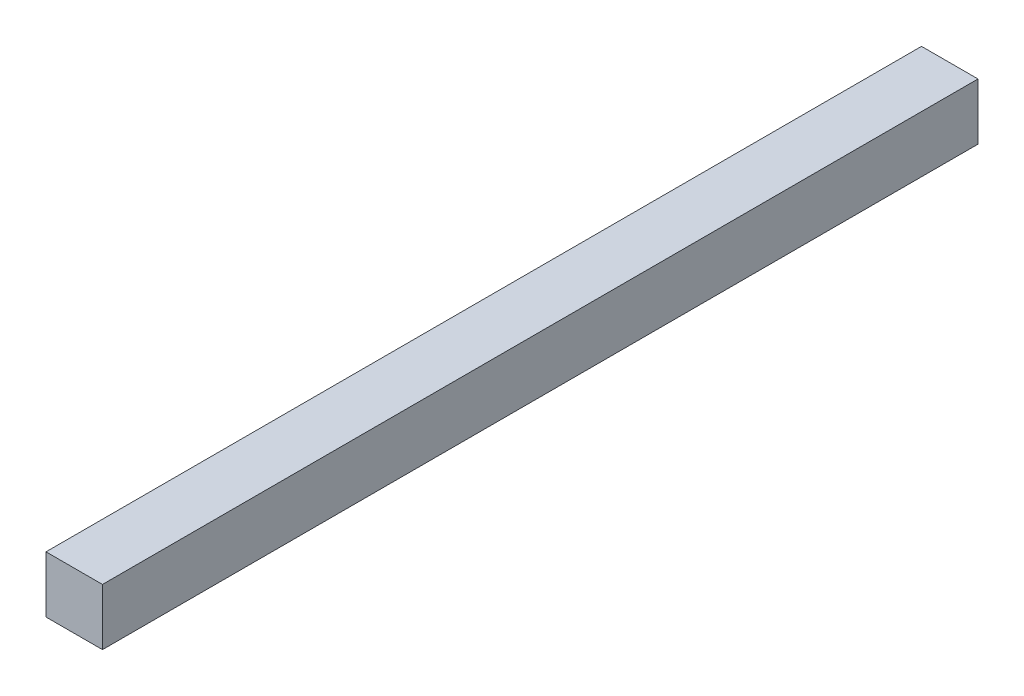
ISO-10303-21;
HEADER;
FILE_DESCRIPTION(('STEP AP214'),'2;1');
FILE_NAME('part.step','',(''),(''),'','','');
FILE_SCHEMA(('AUTOMOTIVE_DESIGN { 1 0 10303 214 1 1 1 1 }'));
ENDSEC;
DATA;
#1=APPLICATION_CONTEXT('core data for automotive mechanical design processes');
#2=APPLICATION_PROTOCOL_DEFINITION('international standard','automotive_design',2000,#1);
#3=PRODUCT_CONTEXT('',#1,'mechanical');
#4=PRODUCT('Part','Part','',(#3));
#5=PRODUCT_RELATED_PRODUCT_CATEGORY('part','',(#4));
#6=PRODUCT_DEFINITION_FORMATION('','',#4);
#7=PRODUCT_DEFINITION_CONTEXT('part definition',#1,'design');
#8=PRODUCT_DEFINITION('design','',#6,#7);
#9=PRODUCT_DEFINITION_SHAPE('','',#8);
#10=(LENGTH_UNIT() NAMED_UNIT(*) SI_UNIT(.MILLI.,.METRE.));
#11=(NAMED_UNIT(*) PLANE_ANGLE_UNIT() SI_UNIT($,.RADIAN.));
#12=(NAMED_UNIT(*) SI_UNIT($,.STERADIAN.) SOLID_ANGLE_UNIT());
#13=UNCERTAINTY_MEASURE_WITH_UNIT(LENGTH_MEASURE(1.E-05),#10,'distance_accuracy_value','');
#14=(GEOMETRIC_REPRESENTATION_CONTEXT(3) GLOBAL_UNCERTAINTY_ASSIGNED_CONTEXT((#13)) GLOBAL_UNIT_ASSIGNED_CONTEXT((#10,
#11,#12)) REPRESENTATION_CONTEXT('',''));
#15=CARTESIAN_POINT('',(0.,0.,0.));
#16=DIRECTION('',(0.,0.,1.));
#17=DIRECTION('',(1.,0.,0.));
#18=AXIS2_PLACEMENT_3D('',#15,#16,#17);
#19=CARTESIAN_POINT('',(-10.,10.,310.));
#20=DIRECTION('',(1.,0.,0.));
#21=DIRECTION('',(0.,0.,-1.));
#22=AXIS2_PLACEMENT_3D('',#19,#20,#21);
#23=PLANE('',#22);
#24=DIRECTION('',(0.,-1.,0.));
#25=VECTOR('',#24,1.);
#26=CARTESIAN_POINT('',(-10.,10.,0.));
#27=LINE('',#26,#25);
#28=CARTESIAN_POINT('',(-10.,10.,0.));
#29=VERTEX_POINT('',#28);
#30=CARTESIAN_POINT('',(-10.,-10.,0.));
#31=VERTEX_POINT('',#30);
#32=EDGE_CURVE('E101',#29,#31,#27,.T.);
#33=ORIENTED_EDGE('',*,*,#32,.T.);
#34=DIRECTION('',(0.,0.,-1.));
#35=VECTOR('',#34,1.);
#36=CARTESIAN_POINT('',(-10.,-10.,310.));
#37=LINE('',#36,#35);
#38=CARTESIAN_POINT('',(-10.,-10.,310.));
#39=VERTEX_POINT('',#38);
#40=EDGE_CURVE('E11',#39,#31,#37,.T.);
#41=ORIENTED_EDGE('',*,*,#40,.F.);
#42=DIRECTION('',(0.,-1.,0.));
#43=VECTOR('',#42,1.);
#44=CARTESIAN_POINT('',(-10.,10.,310.));
#45=LINE('',#44,#43);
#46=CARTESIAN_POINT('',(-10.,10.,310.));
#47=VERTEX_POINT('',#46);
#48=EDGE_CURVE('E89',#47,#39,#45,.T.);
#49=ORIENTED_EDGE('',*,*,#48,.F.);
#50=DIRECTION('',(0.,0.,-1.));
#51=VECTOR('',#50,1.);
#52=CARTESIAN_POINT('',(-10.,10.,310.));
#53=LINE('',#52,#51);
#54=EDGE_CURVE('E97',#47,#29,#53,.T.);
#55=ORIENTED_EDGE('',*,*,#54,.T.);
#56=EDGE_LOOP('',(#33,#41,#49,#55));
#57=FACE_BOUND('',#56,.T.);
#58=ADVANCED_FACE('F38',(#57),#23,.F.);
#59=CARTESIAN_POINT('',(-10.,-10.,310.));
#60=DIRECTION('',(0.,1.,0.));
#61=DIRECTION('',(0.,0.,1.));
#62=AXIS2_PLACEMENT_3D('',#59,#60,#61);
#63=PLANE('',#62);
#64=DIRECTION('',(1.,0.,0.));
#65=VECTOR('',#64,1.);
#66=CARTESIAN_POINT('',(-10.,-10.,0.));
#67=LINE('',#66,#65);
#68=CARTESIAN_POINT('',(10.,-10.,0.));
#69=VERTEX_POINT('',#68);
#70=EDGE_CURVE('E93',#31,#69,#67,.T.);
#71=ORIENTED_EDGE('',*,*,#70,.T.);
#72=DIRECTION('',(0.,0.,-1.));
#73=VECTOR('',#72,1.);
#74=CARTESIAN_POINT('',(10.,-10.,310.));
#75=LINE('',#74,#73);
#76=CARTESIAN_POINT('',(10.,-10.,310.));
#77=VERTEX_POINT('',#76);
#78=EDGE_CURVE('E46',#77,#69,#75,.T.);
#79=ORIENTED_EDGE('',*,*,#78,.F.);
#80=DIRECTION('',(1.,0.,0.));
#81=VECTOR('',#80,1.);
#82=CARTESIAN_POINT('',(-10.,-10.,310.));
#83=LINE('',#82,#81);
#84=EDGE_CURVE('E84',#39,#77,#83,.T.);
#85=ORIENTED_EDGE('',*,*,#84,.F.);
#86=ORIENTED_EDGE('',*,*,#40,.T.);
#87=EDGE_LOOP('',(#71,#79,#85,#86));
#88=FACE_BOUND('',#87,.T.);
#89=ADVANCED_FACE('F92',(#88),#63,.F.);
#90=CARTESIAN_POINT('',(10.,10.,310.));
#91=DIRECTION('',(-1.,0.,0.));
#92=DIRECTION('',(0.,-1.,0.));
#93=AXIS2_PLACEMENT_3D('',#90,#91,#92);
#94=PLANE('',#93);
#95=DIRECTION('',(0.,1.,0.));
#96=VECTOR('',#95,1.);
#97=CARTESIAN_POINT('',(10.,10.,0.));
#98=LINE('',#97,#96);
#99=CARTESIAN_POINT('',(10.,10.,0.));
#100=VERTEX_POINT('',#99);
#101=EDGE_CURVE('E71',#69,#100,#98,.T.);
#102=ORIENTED_EDGE('',*,*,#101,.T.);
#103=DIRECTION('',(0.,0.,-1.));
#104=VECTOR('',#103,1.);
#105=CARTESIAN_POINT('',(10.,10.,310.));
#106=LINE('',#105,#104);
#107=CARTESIAN_POINT('',(10.,10.,310.));
#108=VERTEX_POINT('',#107);
#109=EDGE_CURVE('E94',#108,#100,#106,.T.);
#110=ORIENTED_EDGE('',*,*,#109,.F.);
#111=DIRECTION('',(0.,1.,0.));
#112=VECTOR('',#111,1.);
#113=CARTESIAN_POINT('',(10.,10.,310.));
#114=LINE('',#113,#112);
#115=EDGE_CURVE('E87',#77,#108,#114,.T.);
#116=ORIENTED_EDGE('',*,*,#115,.F.);
#117=ORIENTED_EDGE('',*,*,#78,.T.);
#118=EDGE_LOOP('',(#102,#110,#116,#117));
#119=FACE_BOUND('',#118,.T.);
#120=ADVANCED_FACE('F95',(#119),#94,.F.);
#121=CARTESIAN_POINT('',(-10.,10.,310.));
#122=DIRECTION('',(0.,-1.,0.));
#123=DIRECTION('',(0.,0.,-1.));
#124=AXIS2_PLACEMENT_3D('',#121,#122,#123);
#125=PLANE('',#124);
#126=DIRECTION('',(-1.,0.,0.));
#127=VECTOR('',#126,1.);
#128=CARTESIAN_POINT('',(-10.,10.,0.));
#129=LINE('',#128,#127);
#130=EDGE_CURVE('E77',#100,#29,#129,.T.);
#131=ORIENTED_EDGE('',*,*,#130,.T.);
#132=ORIENTED_EDGE('',*,*,#54,.F.);
#133=DIRECTION('',(-1.,0.,0.));
#134=VECTOR('',#133,1.);
#135=CARTESIAN_POINT('',(-10.,10.,310.));
#136=LINE('',#135,#134);
#137=EDGE_CURVE('E54',#108,#47,#136,.T.);
#138=ORIENTED_EDGE('',*,*,#137,.F.);
#139=ORIENTED_EDGE('',*,*,#109,.T.);
#140=EDGE_LOOP('',(#131,#132,#138,#139));
#141=FACE_BOUND('',#140,.T.);
#142=ADVANCED_FACE('F108',(#141),#125,.F.);
#143=CARTESIAN_POINT('',(0.,0.,310.));
#144=DIRECTION('',(0.,0.,1.));
#145=DIRECTION('',(1.,0.,0.));
#146=AXIS2_PLACEMENT_3D('',#143,#144,#145);
#147=PLANE('',#146);
#148=ORIENTED_EDGE('',*,*,#48,.T.);
#149=ORIENTED_EDGE('',*,*,#84,.T.);
#150=ORIENTED_EDGE('',*,*,#115,.T.);
#151=ORIENTED_EDGE('',*,*,#137,.T.);
#152=EDGE_LOOP('',(#148,#149,#150,#151));
#153=FACE_BOUND('',#152,.T.);
#154=ADVANCED_FACE('F85',(#153),#147,.T.);
#155=CARTESIAN_POINT('',(0.,0.,0.));
#156=DIRECTION('',(0.,0.,1.));
#157=DIRECTION('',(1.,0.,0.));
#158=AXIS2_PLACEMENT_3D('',#155,#156,#157);
#159=PLANE('',#158);
#160=ORIENTED_EDGE('',*,*,#32,.F.);
#161=ORIENTED_EDGE('',*,*,#130,.F.);
#162=ORIENTED_EDGE('',*,*,#101,.F.);
#163=ORIENTED_EDGE('',*,*,#70,.F.);
#164=EDGE_LOOP('',(#160,#161,#162,#163));
#165=FACE_BOUND('',#164,.T.);
#166=ADVANCED_FACE('F111',(#165),#159,.F.);
#167=CLOSED_SHELL('',(#58,#89,#120,#142,#154,#166));
#168=MANIFOLD_SOLID_BREP('B2',#167);
#169=ADVANCED_BREP_SHAPE_REPRESENTATION('',(#18,#168),#14);
#170=SHAPE_DEFINITION_REPRESENTATION(#9,#169);
ENDSEC;
END-ISO-10303-21;
